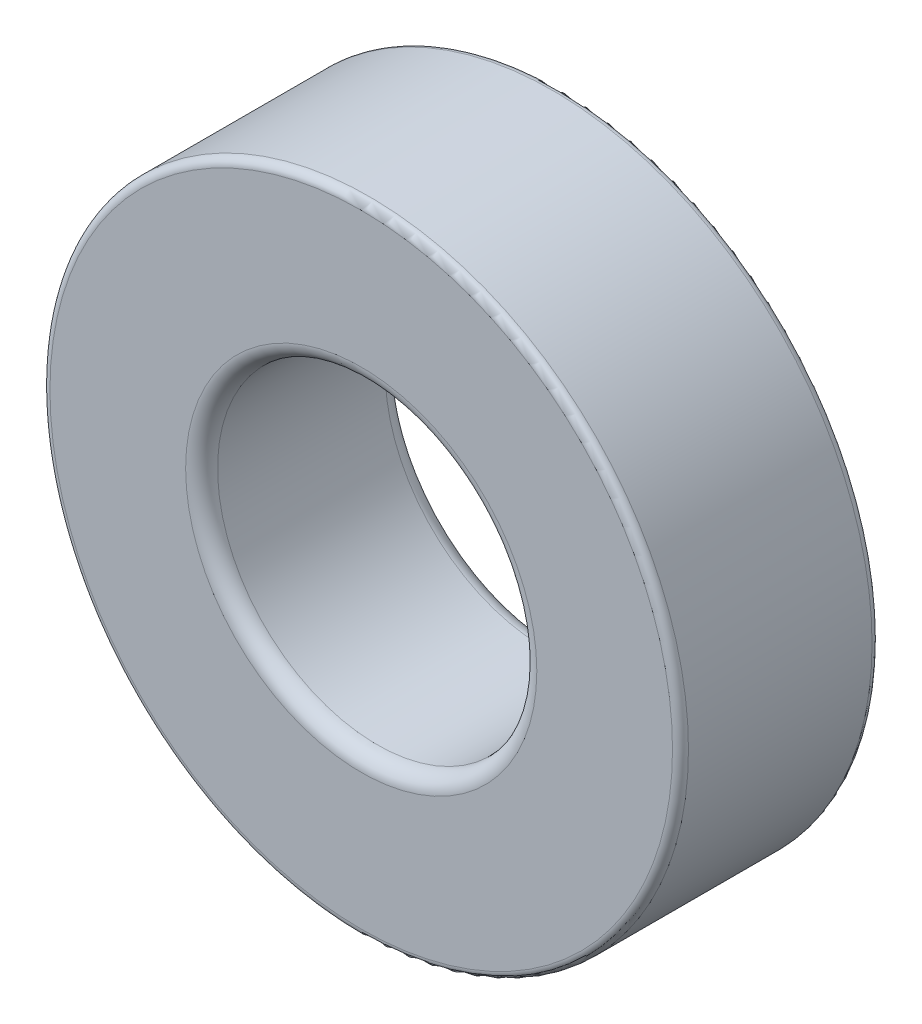
ISO-10303-21;
HEADER;
FILE_DESCRIPTION(('STEP AP214'),'2;1');
FILE_NAME('part.step','',(''),(''),'','','');
FILE_SCHEMA(('AUTOMOTIVE_DESIGN { 1 0 10303 214 1 1 1 1 }'));
ENDSEC;
DATA;
#1=APPLICATION_CONTEXT('core data for automotive mechanical design processes');
#2=APPLICATION_PROTOCOL_DEFINITION('international standard','automotive_design',2000,#1);
#3=PRODUCT_CONTEXT('',#1,'mechanical');
#4=PRODUCT('Part','Part','',(#3));
#5=PRODUCT_RELATED_PRODUCT_CATEGORY('part','',(#4));
#6=PRODUCT_DEFINITION_FORMATION('','',#4);
#7=PRODUCT_DEFINITION_CONTEXT('part definition',#1,'design');
#8=PRODUCT_DEFINITION('design','',#6,#7);
#9=PRODUCT_DEFINITION_SHAPE('','',#8);
#10=(LENGTH_UNIT() NAMED_UNIT(*) SI_UNIT(.MILLI.,.METRE.));
#11=(NAMED_UNIT(*) PLANE_ANGLE_UNIT() SI_UNIT($,.RADIAN.));
#12=(NAMED_UNIT(*) SI_UNIT($,.STERADIAN.) SOLID_ANGLE_UNIT());
#13=UNCERTAINTY_MEASURE_WITH_UNIT(LENGTH_MEASURE(1.E-05),#10,'distance_accuracy_value','');
#14=(GEOMETRIC_REPRESENTATION_CONTEXT(3) GLOBAL_UNCERTAINTY_ASSIGNED_CONTEXT((#13)) GLOBAL_UNIT_ASSIGNED_CONTEXT((#10,
#11,#12)) REPRESENTATION_CONTEXT('',''));
#15=CARTESIAN_POINT('',(0.,0.,0.));
#16=DIRECTION('',(0.,0.,1.));
#17=DIRECTION('',(1.,0.,0.));
#18=AXIS2_PLACEMENT_3D('',#15,#16,#17);
#19=CARTESIAN_POINT('',(0.,0.,-2.5));
#20=DIRECTION('',(0.,0.,1.));
#21=DIRECTION('',(1.,0.,0.));
#22=AXIS2_PLACEMENT_3D('',#19,#20,#21);
#23=CYLINDRICAL_SURFACE('',#22,8.);
#24=CARTESIAN_POINT('',(0.,0.,-2.3));
#25=DIRECTION('',(0.,0.,1.));
#26=DIRECTION('',(1.,0.,0.));
#27=AXIS2_PLACEMENT_3D('',#24,#25,#26);
#28=CIRCLE('',#27,8.);
#29=CARTESIAN_POINT('',(8.,0.,-2.3));
#30=VERTEX_POINT('',#29);
#31=EDGE_CURVE('E59',#30,#30,#28,.T.);
#32=ORIENTED_EDGE('',*,*,#31,.T.);
#33=EDGE_LOOP('',(#32));
#34=FACE_BOUND('',#33,.T.);
#35=CARTESIAN_POINT('',(0.,0.,2.3));
#36=DIRECTION('',(0.,0.,1.));
#37=DIRECTION('',(1.,0.,0.));
#38=AXIS2_PLACEMENT_3D('',#35,#36,#37);
#39=CIRCLE('',#38,8.);
#40=CARTESIAN_POINT('',(8.,0.,2.3));
#41=VERTEX_POINT('',#40);
#42=EDGE_CURVE('E62',#41,#41,#39,.F.);
#43=ORIENTED_EDGE('',*,*,#42,.T.);
#44=EDGE_LOOP('',(#43));
#45=FACE_BOUND('',#44,.T.);
#46=ADVANCED_FACE('F33',(#34,#45),#23,.T.);
#47=CARTESIAN_POINT('',(0.,0.,-2.5));
#48=DIRECTION('',(0.,0.,1.));
#49=DIRECTION('',(1.,0.,0.));
#50=AXIS2_PLACEMENT_3D('',#47,#48,#49);
#51=PLANE('',#50);
#52=CARTESIAN_POINT('',(0.,0.,-2.5));
#53=DIRECTION('',(0.,0.,1.));
#54=DIRECTION('',(1.,0.,0.));
#55=AXIS2_PLACEMENT_3D('',#52,#53,#54);
#56=CIRCLE('',#55,4.4);
#57=CARTESIAN_POINT('',(4.4,0.,-2.5));
#58=VERTEX_POINT('',#57);
#59=EDGE_CURVE('E48',#58,#58,#56,.T.);
#60=ORIENTED_EDGE('',*,*,#59,.T.);
#61=EDGE_LOOP('',(#60));
#62=FACE_BOUND('',#61,.T.);
#63=CARTESIAN_POINT('',(0.,0.,-2.5));
#64=DIRECTION('',(0.,0.,1.));
#65=DIRECTION('',(1.,0.,0.));
#66=AXIS2_PLACEMENT_3D('',#63,#64,#65);
#67=CIRCLE('',#66,7.8);
#68=CARTESIAN_POINT('',(7.8,0.,-2.5));
#69=VERTEX_POINT('',#68);
#70=EDGE_CURVE('E56',#69,#69,#67,.F.);
#71=ORIENTED_EDGE('',*,*,#70,.T.);
#72=EDGE_LOOP('',(#71));
#73=FACE_BOUND('',#72,.T.);
#74=ADVANCED_FACE('F85',(#62,#73),#51,.F.);
#75=CARTESIAN_POINT('',(0.,0.,-2.5));
#76=DIRECTION('',(0.,0.,1.));
#77=DIRECTION('',(1.,0.,0.));
#78=AXIS2_PLACEMENT_3D('',#75,#76,#77);
#79=CYLINDRICAL_SURFACE('',#78,4.);
#80=CARTESIAN_POINT('',(0.,0.,-2.1));
#81=DIRECTION('',(0.,0.,1.));
#82=DIRECTION('',(1.,0.,0.));
#83=AXIS2_PLACEMENT_3D('',#80,#81,#82);
#84=CIRCLE('',#83,4.);
#85=CARTESIAN_POINT('',(4.,0.,-2.1));
#86=VERTEX_POINT('',#85);
#87=EDGE_CURVE('E40',#86,#86,#84,.F.);
#88=ORIENTED_EDGE('',*,*,#87,.T.);
#89=EDGE_LOOP('',(#88));
#90=FACE_BOUND('',#89,.T.);
#91=CARTESIAN_POINT('',(0.,0.,2.1));
#92=DIRECTION('',(0.,0.,1.));
#93=DIRECTION('',(1.,0.,0.));
#94=AXIS2_PLACEMENT_3D('',#91,#92,#93);
#95=CIRCLE('',#94,4.);
#96=CARTESIAN_POINT('',(4.,0.,2.1));
#97=VERTEX_POINT('',#96);
#98=EDGE_CURVE('E44',#97,#97,#95,.T.);
#99=ORIENTED_EDGE('',*,*,#98,.T.);
#100=EDGE_LOOP('',(#99));
#101=FACE_BOUND('',#100,.T.);
#102=ADVANCED_FACE('F77',(#90,#101),#79,.F.);
#103=CARTESIAN_POINT('',(0.,0.,2.5));
#104=DIRECTION('',(0.,0.,1.));
#105=DIRECTION('',(1.,0.,0.));
#106=AXIS2_PLACEMENT_3D('',#103,#104,#105);
#107=PLANE('',#106);
#108=CARTESIAN_POINT('',(0.,0.,2.5));
#109=DIRECTION('',(0.,0.,1.));
#110=DIRECTION('',(1.,0.,0.));
#111=AXIS2_PLACEMENT_3D('',#108,#109,#110);
#112=CIRCLE('',#111,4.4);
#113=CARTESIAN_POINT('',(4.4,0.,2.5));
#114=VERTEX_POINT('',#113);
#115=EDGE_CURVE('E10',#114,#114,#112,.F.);
#116=ORIENTED_EDGE('',*,*,#115,.T.);
#117=EDGE_LOOP('',(#116));
#118=FACE_BOUND('',#117,.T.);
#119=CARTESIAN_POINT('',(0.,0.,2.5));
#120=DIRECTION('',(0.,0.,1.));
#121=DIRECTION('',(1.,0.,0.));
#122=AXIS2_PLACEMENT_3D('',#119,#120,#121);
#123=CIRCLE('',#122,7.8);
#124=CARTESIAN_POINT('',(7.8,0.,2.5));
#125=VERTEX_POINT('',#124);
#126=EDGE_CURVE('E53',#125,#125,#123,.T.);
#127=ORIENTED_EDGE('',*,*,#126,.T.);
#128=EDGE_LOOP('',(#127));
#129=FACE_BOUND('',#128,.T.);
#130=ADVANCED_FACE('F75',(#118,#129),#107,.T.);
#131=CARTESIAN_POINT('',(0.,0.,-2.3));
#132=DIRECTION('',(0.,0.,1.));
#133=DIRECTION('',(1.,0.,0.));
#134=AXIS2_PLACEMENT_3D('',#131,#132,#133);
#135=TOROIDAL_SURFACE('',#134,7.8,0.2);
#136=ORIENTED_EDGE('',*,*,#70,.F.);
#137=EDGE_LOOP('',(#136));
#138=FACE_BOUND('',#137,.T.);
#139=ORIENTED_EDGE('',*,*,#31,.F.);
#140=EDGE_LOOP('',(#139));
#141=FACE_BOUND('',#140,.T.);
#142=ADVANCED_FACE('F71',(#138,#141),#135,.T.);
#143=CARTESIAN_POINT('',(0.,0.,2.3));
#144=DIRECTION('',(0.,0.,1.));
#145=DIRECTION('',(1.,0.,0.));
#146=AXIS2_PLACEMENT_3D('',#143,#144,#145);
#147=TOROIDAL_SURFACE('',#146,7.8,0.2);
#148=ORIENTED_EDGE('',*,*,#42,.F.);
#149=EDGE_LOOP('',(#148));
#150=FACE_BOUND('',#149,.T.);
#151=ORIENTED_EDGE('',*,*,#126,.F.);
#152=EDGE_LOOP('',(#151));
#153=FACE_BOUND('',#152,.T.);
#154=ADVANCED_FACE('F67',(#150,#153),#147,.T.);
#155=CARTESIAN_POINT('',(0.,0.,-2.1));
#156=DIRECTION('',(0.,0.,1.));
#157=DIRECTION('',(1.,0.,0.));
#158=AXIS2_PLACEMENT_3D('',#155,#156,#157);
#159=TOROIDAL_SURFACE('',#158,4.4,0.4);
#160=ORIENTED_EDGE('',*,*,#87,.F.);
#161=EDGE_LOOP('',(#160));
#162=FACE_BOUND('',#161,.T.);
#163=ORIENTED_EDGE('',*,*,#59,.F.);
#164=EDGE_LOOP('',(#163));
#165=FACE_BOUND('',#164,.T.);
#166=ADVANCED_FACE('F70',(#162,#165),#159,.T.);
#167=CARTESIAN_POINT('',(0.,0.,2.1));
#168=DIRECTION('',(0.,0.,1.));
#169=DIRECTION('',(1.,0.,0.));
#170=AXIS2_PLACEMENT_3D('',#167,#168,#169);
#171=TOROIDAL_SURFACE('',#170,4.4,0.4);
#172=ORIENTED_EDGE('',*,*,#115,.F.);
#173=EDGE_LOOP('',(#172));
#174=FACE_BOUND('',#173,.T.);
#175=ORIENTED_EDGE('',*,*,#98,.F.);
#176=EDGE_LOOP('',(#175));
#177=FACE_BOUND('',#176,.T.);
#178=ADVANCED_FACE('F35',(#174,#177),#171,.T.);
#179=CLOSED_SHELL('',(#46,#74,#102,#130,#142,#154,#166,#178));
#180=MANIFOLD_SOLID_BREP('B2',#179);
#181=ADVANCED_BREP_SHAPE_REPRESENTATION('',(#18,#180),#14);
#182=SHAPE_DEFINITION_REPRESENTATION(#9,#181);
ENDSEC;
END-ISO-10303-21;
